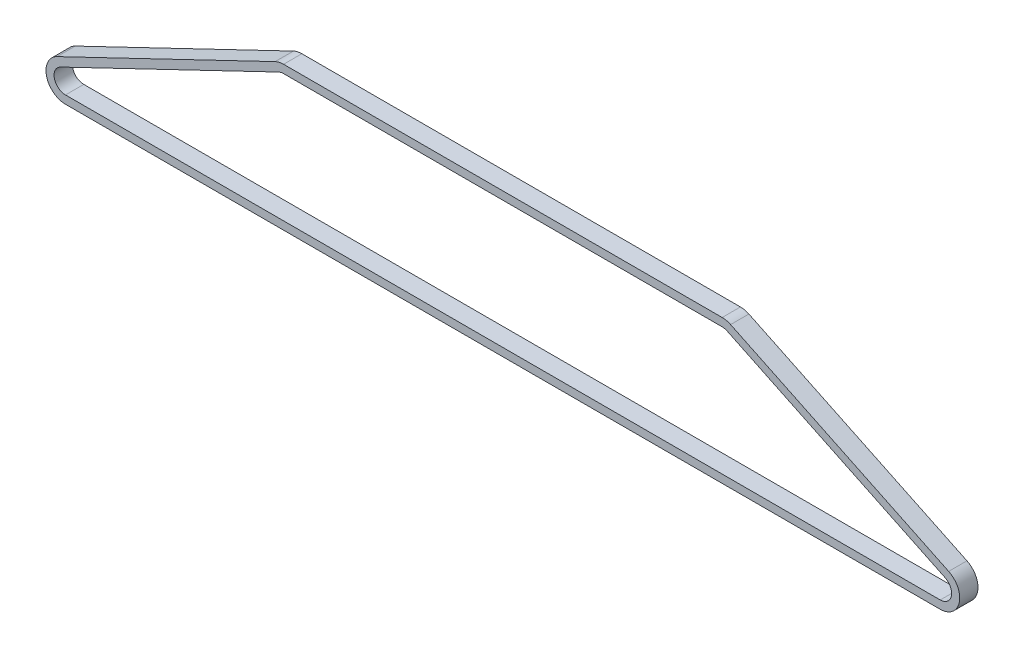
ISO-10303-21;
HEADER;
FILE_DESCRIPTION(('STEP AP214'),'2;1');
FILE_NAME('part.step','',(''),(''),'','','');
FILE_SCHEMA(('AUTOMOTIVE_DESIGN { 1 0 10303 214 1 1 1 1 }'));
ENDSEC;
DATA;
#1=APPLICATION_CONTEXT('core data for automotive mechanical design processes');
#2=APPLICATION_PROTOCOL_DEFINITION('international standard','automotive_design',2000,#1);
#3=PRODUCT_CONTEXT('',#1,'mechanical');
#4=PRODUCT('Part','Part','',(#3));
#5=PRODUCT_RELATED_PRODUCT_CATEGORY('part','',(#4));
#6=PRODUCT_DEFINITION_FORMATION('','',#4);
#7=PRODUCT_DEFINITION_CONTEXT('part definition',#1,'design');
#8=PRODUCT_DEFINITION('design','',#6,#7);
#9=PRODUCT_DEFINITION_SHAPE('','',#8);
#10=(LENGTH_UNIT() NAMED_UNIT(*) SI_UNIT(.MILLI.,.METRE.));
#11=(NAMED_UNIT(*) PLANE_ANGLE_UNIT() SI_UNIT($,.RADIAN.));
#12=(NAMED_UNIT(*) SI_UNIT($,.STERADIAN.) SOLID_ANGLE_UNIT());
#13=UNCERTAINTY_MEASURE_WITH_UNIT(LENGTH_MEASURE(1.E-05),#10,'distance_accuracy_value','');
#14=(GEOMETRIC_REPRESENTATION_CONTEXT(3) GLOBAL_UNCERTAINTY_ASSIGNED_CONTEXT((#13)) GLOBAL_UNIT_ASSIGNED_CONTEXT((#10,
#11,#12)) REPRESENTATION_CONTEXT('',''));
#15=CARTESIAN_POINT('',(0.,0.,0.));
#16=DIRECTION('',(0.,0.,1.));
#17=DIRECTION('',(1.,0.,0.));
#18=AXIS2_PLACEMENT_3D('',#15,#16,#17);
#19=CARTESIAN_POINT('',(0.,-20.3867300504674,3.));
#20=DIRECTION('',(0.,-1.,0.));
#21=DIRECTION('',(1.,0.,0.));
#22=AXIS2_PLACEMENT_3D('',#19,#20,#21);
#23=PLANE('',#22);
#24=DIRECTION('',(-1.,0.,0.));
#25=VECTOR('',#24,1.);
#26=CARTESIAN_POINT('',(0.,-20.3867300504674,0.));
#27=LINE('',#26,#25);
#28=CARTESIAN_POINT('',(35.8,-20.3867300504674,0.));
#29=VERTEX_POINT('',#28);
#30=CARTESIAN_POINT('',(-107.8,-20.3867300504674,0.));
#31=VERTEX_POINT('',#30);
#32=EDGE_CURVE('E213',#29,#31,#27,.T.);
#33=ORIENTED_EDGE('',*,*,#32,.F.);
#34=DIRECTION('',(0.,0.,-1.));
#35=VECTOR('',#34,1.);
#36=CARTESIAN_POINT('',(35.8,-20.3867300504674,3.));
#37=LINE('',#36,#35);
#38=CARTESIAN_POINT('',(35.8,-20.3867300504674,3.));
#39=VERTEX_POINT('',#38);
#40=EDGE_CURVE('E11',#39,#29,#37,.T.);
#41=ORIENTED_EDGE('',*,*,#40,.F.);
#42=DIRECTION('',(-1.,0.,0.));
#43=VECTOR('',#42,1.);
#44=CARTESIAN_POINT('',(0.,-20.3867300504674,3.));
#45=LINE('',#44,#43);
#46=CARTESIAN_POINT('',(-107.8,-20.3867300504674,3.));
#47=VERTEX_POINT('',#46);
#48=EDGE_CURVE('E487',#39,#47,#45,.T.);
#49=ORIENTED_EDGE('',*,*,#48,.T.);
#50=DIRECTION('',(0.,0.,-1.));
#51=VECTOR('',#50,1.);
#52=CARTESIAN_POINT('',(-107.8,-20.3867300504674,3.));
#53=LINE('',#52,#51);
#54=EDGE_CURVE('E118',#47,#31,#53,.T.);
#55=ORIENTED_EDGE('',*,*,#54,.T.);
#56=EDGE_LOOP('',(#33,#41,#49,#55));
#57=FACE_BOUND('',#56,.T.);
#58=ADVANCED_FACE('F41',(#57),#23,.T.);
#59=CARTESIAN_POINT('',(35.8,-17.1867300504674,3.));
#60=DIRECTION('',(0.,0.,-1.));
#61=DIRECTION('',(-1.,0.,0.));
#62=AXIS2_PLACEMENT_3D('',#59,#60,#61);
#63=CYLINDRICAL_SURFACE('',#62,3.19999999999998);
#64=CARTESIAN_POINT('',(35.8,-17.1867300504674,0.));
#65=DIRECTION('',(0.,0.,1.));
#66=DIRECTION('',(1.,0.,0.));
#67=AXIS2_PLACEMENT_3D('',#64,#65,#66);
#68=CIRCLE('',#67,3.19999999999998);
#69=CARTESIAN_POINT('',(37.1849182085513,-14.3019420936805,0.));
#70=VERTEX_POINT('',#69);
#71=EDGE_CURVE('E216',#29,#70,#68,.T.);
#72=ORIENTED_EDGE('',*,*,#71,.T.);
#73=DIRECTION('',(0.,0.,-1.));
#74=VECTOR('',#73,1.);
#75=CARTESIAN_POINT('',(37.1849182085513,-14.3019420936805,3.));
#76=LINE('',#75,#74);
#77=CARTESIAN_POINT('',(37.1849182085513,-14.3019420936805,3.));
#78=VERTEX_POINT('',#77);
#79=EDGE_CURVE('E51',#78,#70,#76,.T.);
#80=ORIENTED_EDGE('',*,*,#79,.F.);
#81=CARTESIAN_POINT('',(35.8,-17.1867300504674,3.));
#82=DIRECTION('',(0.,0.,1.));
#83=DIRECTION('',(1.,0.,0.));
#84=AXIS2_PLACEMENT_3D('',#81,#82,#83);
#85=CIRCLE('',#84,3.19999999999998);
#86=EDGE_CURVE('E485',#39,#78,#85,.T.);
#87=ORIENTED_EDGE('',*,*,#86,.F.);
#88=ORIENTED_EDGE('',*,*,#40,.T.);
#89=EDGE_LOOP('',(#72,#80,#87,#88));
#90=FACE_BOUND('',#89,.T.);
#91=ADVANCED_FACE('F305',(#90),#63,.T.);
#92=CARTESIAN_POINT('',(1.38491820855131,2.88478795678694,3.));
#93=DIRECTION('',(-0.432786940172284,-0.901496236495922,0.));
#94=DIRECTION('',(0.901496236495922,-0.432786940172284,0.));
#95=AXIS2_PLACEMENT_3D('',#92,#93,#94);
#96=PLANE('',#95);
#97=DIRECTION('',(-0.901496236495922,0.432786940172284,0.));
#98=VECTOR('',#97,1.);
#99=CARTESIAN_POINT('',(1.38491820855131,2.88478795678694,0.));
#100=LINE('',#99,#98);
#101=CARTESIAN_POINT('',(1.3849182085513,2.88478795678695,0.));
#102=VERTEX_POINT('',#101);
#103=EDGE_CURVE('E219',#70,#102,#100,.T.);
#104=ORIENTED_EDGE('',*,*,#103,.T.);
#105=DIRECTION('',(0.,0.,-1.));
#106=VECTOR('',#105,1.);
#107=CARTESIAN_POINT('',(1.3849182085513,2.88478795678695,3.));
#108=LINE('',#107,#106);
#109=CARTESIAN_POINT('',(1.3849182085513,2.88478795678695,3.));
#110=VERTEX_POINT('',#109);
#111=EDGE_CURVE('E239',#110,#102,#108,.T.);
#112=ORIENTED_EDGE('',*,*,#111,.F.);
#113=DIRECTION('',(-0.901496236495922,0.432786940172284,0.));
#114=VECTOR('',#113,1.);
#115=CARTESIAN_POINT('',(1.38491820855131,2.88478795678694,3.));
#116=LINE('',#115,#114);
#117=EDGE_CURVE('E481',#78,#110,#116,.T.);
#118=ORIENTED_EDGE('',*,*,#117,.F.);
#119=ORIENTED_EDGE('',*,*,#79,.T.);
#120=EDGE_LOOP('',(#104,#112,#118,#119));
#121=FACE_BOUND('',#120,.T.);
#122=ADVANCED_FACE('F310',(#121),#96,.F.);
#123=CARTESIAN_POINT('',(0.,0.,3.));
#124=DIRECTION('',(0.,0.,-1.));
#125=DIRECTION('',(-1.,0.,0.));
#126=AXIS2_PLACEMENT_3D('',#123,#124,#125);
#127=CYLINDRICAL_SURFACE('',#126,3.2);
#128=CARTESIAN_POINT('',(0.,0.,0.));
#129=DIRECTION('',(0.,0.,1.));
#130=DIRECTION('',(1.,0.,0.));
#131=AXIS2_PLACEMENT_3D('',#128,#129,#130);
#132=CIRCLE('',#131,3.2);
#133=CARTESIAN_POINT('',(0.,3.2,0.));
#134=VERTEX_POINT('',#133);
#135=EDGE_CURVE('E222',#102,#134,#132,.T.);
#136=ORIENTED_EDGE('',*,*,#135,.T.);
#137=DIRECTION('',(0.,0.,-1.));
#138=VECTOR('',#137,1.);
#139=CARTESIAN_POINT('',(0.,3.2,3.));
#140=LINE('',#139,#138);
#141=CARTESIAN_POINT('',(0.,3.2,3.));
#142=VERTEX_POINT('',#141);
#143=EDGE_CURVE('E237',#142,#134,#140,.T.);
#144=ORIENTED_EDGE('',*,*,#143,.F.);
#145=CARTESIAN_POINT('',(0.,0.,3.));
#146=DIRECTION('',(0.,0.,1.));
#147=DIRECTION('',(1.,0.,0.));
#148=AXIS2_PLACEMENT_3D('',#145,#146,#147);
#149=CIRCLE('',#148,3.2);
#150=EDGE_CURVE('E479',#110,#142,#149,.T.);
#151=ORIENTED_EDGE('',*,*,#150,.F.);
#152=ORIENTED_EDGE('',*,*,#111,.T.);
#153=EDGE_LOOP('',(#136,#144,#151,#152));
#154=FACE_BOUND('',#153,.T.);
#155=ADVANCED_FACE('F428',(#154),#127,.T.);
#156=CARTESIAN_POINT('',(0.,3.2,3.));
#157=DIRECTION('',(0.,1.,0.));
#158=DIRECTION('',(0.,0.,1.));
#159=AXIS2_PLACEMENT_3D('',#156,#157,#158);
#160=PLANE('',#159);
#161=DIRECTION('',(1.,0.,0.));
#162=VECTOR('',#161,1.);
#163=CARTESIAN_POINT('',(0.,3.2,0.));
#164=LINE('',#163,#162);
#165=CARTESIAN_POINT('',(-72.,3.2,0.));
#166=VERTEX_POINT('',#165);
#167=EDGE_CURVE('E225',#166,#134,#164,.T.);
#168=ORIENTED_EDGE('',*,*,#167,.F.);
#169=DIRECTION('',(0.,0.,-1.));
#170=VECTOR('',#169,1.);
#171=CARTESIAN_POINT('',(-72.,3.2,3.));
#172=LINE('',#171,#170);
#173=CARTESIAN_POINT('',(-72.,3.2,3.));
#174=VERTEX_POINT('',#173);
#175=EDGE_CURVE('E181',#174,#166,#172,.T.);
#176=ORIENTED_EDGE('',*,*,#175,.F.);
#177=DIRECTION('',(1.,0.,0.));
#178=VECTOR('',#177,1.);
#179=CARTESIAN_POINT('',(0.,3.2,3.));
#180=LINE('',#179,#178);
#181=EDGE_CURVE('E170',#174,#142,#180,.T.);
#182=ORIENTED_EDGE('',*,*,#181,.T.);
#183=ORIENTED_EDGE('',*,*,#143,.T.);
#184=EDGE_LOOP('',(#168,#176,#182,#183));
#185=FACE_BOUND('',#184,.T.);
#186=ADVANCED_FACE('F420',(#185),#160,.T.);
#187=CARTESIAN_POINT('',(-72.,0.,3.));
#188=DIRECTION('',(0.,0.,-1.));
#189=DIRECTION('',(-1.,0.,0.));
#190=AXIS2_PLACEMENT_3D('',#187,#188,#189);
#191=CYLINDRICAL_SURFACE('',#190,3.19999999999999);
#192=CARTESIAN_POINT('',(-72.,0.,0.));
#193=DIRECTION('',(0.,0.,1.));
#194=DIRECTION('',(1.,0.,0.));
#195=AXIS2_PLACEMENT_3D('',#192,#193,#194);
#196=CIRCLE('',#195,3.19999999999999);
#197=CARTESIAN_POINT('',(-73.3849182085513,2.88478795678694,0.));
#198=VERTEX_POINT('',#197);
#199=EDGE_CURVE('E177',#166,#198,#196,.T.);
#200=ORIENTED_EDGE('',*,*,#199,.T.);
#201=DIRECTION('',(0.,0.,-1.));
#202=VECTOR('',#201,1.);
#203=CARTESIAN_POINT('',(-73.3849182085513,2.88478795678694,3.));
#204=LINE('',#203,#202);
#205=CARTESIAN_POINT('',(-73.3849182085513,2.88478795678694,3.));
#206=VERTEX_POINT('',#205);
#207=EDGE_CURVE('E174',#206,#198,#204,.T.);
#208=ORIENTED_EDGE('',*,*,#207,.F.);
#209=CARTESIAN_POINT('',(-72.,0.,3.));
#210=DIRECTION('',(0.,0.,1.));
#211=DIRECTION('',(1.,0.,0.));
#212=AXIS2_PLACEMENT_3D('',#209,#210,#211);
#213=CIRCLE('',#212,3.19999999999999);
#214=EDGE_CURVE('E164',#174,#206,#213,.T.);
#215=ORIENTED_EDGE('',*,*,#214,.F.);
#216=ORIENTED_EDGE('',*,*,#175,.T.);
#217=EDGE_LOOP('',(#200,#208,#215,#216));
#218=FACE_BOUND('',#217,.T.);
#219=ADVANCED_FACE('F175',(#218),#191,.T.);
#220=CARTESIAN_POINT('',(-14.8708447705768,30.9760053962197,3.));
#221=DIRECTION('',(-0.432786940172284,0.901496236495922,0.));
#222=DIRECTION('',(-0.901496236495923,-0.432786940172284,0.));
#223=AXIS2_PLACEMENT_3D('',#220,#221,#222);
#224=PLANE('',#223);
#225=DIRECTION('',(0.901496236495922,0.432786940172284,0.));
#226=VECTOR('',#225,1.);
#227=CARTESIAN_POINT('',(-14.8708447705768,30.9760053962197,0.));
#228=LINE('',#227,#226);
#229=CARTESIAN_POINT('',(-109.184918208551,-14.3019420936805,0.));
#230=VERTEX_POINT('',#229);
#231=EDGE_CURVE('E229',#230,#198,#228,.T.);
#232=ORIENTED_EDGE('',*,*,#231,.F.);
#233=DIRECTION('',(0.,0.,-1.));
#234=VECTOR('',#233,1.);
#235=CARTESIAN_POINT('',(-109.184918208551,-14.3019420936805,3.));
#236=LINE('',#235,#234);
#237=CARTESIAN_POINT('',(-109.184918208551,-14.3019420936805,3.));
#238=VERTEX_POINT('',#237);
#239=EDGE_CURVE('E111',#238,#230,#236,.T.);
#240=ORIENTED_EDGE('',*,*,#239,.F.);
#241=DIRECTION('',(0.901496236495922,0.432786940172284,0.));
#242=VECTOR('',#241,1.);
#243=CARTESIAN_POINT('',(-14.8708447705768,30.9760053962197,3.));
#244=LINE('',#243,#242);
#245=EDGE_CURVE('E168',#238,#206,#244,.T.);
#246=ORIENTED_EDGE('',*,*,#245,.T.);
#247=ORIENTED_EDGE('',*,*,#207,.T.);
#248=EDGE_LOOP('',(#232,#240,#246,#247));
#249=FACE_BOUND('',#248,.T.);
#250=ADVANCED_FACE('F183',(#249),#224,.T.);
#251=CARTESIAN_POINT('',(0.,0.,3.));
#252=DIRECTION('',(0.,0.,-1.));
#253=DIRECTION('',(-1.,0.,0.));
#254=AXIS2_PLACEMENT_3D('',#251,#252,#253);
#255=CYLINDRICAL_SURFACE('',#254,1.87200000000192);
#256=CARTESIAN_POINT('',(0.,0.,0.));
#257=DIRECTION('',(0.,0.,1.));
#258=DIRECTION('',(1.,0.,0.));
#259=AXIS2_PLACEMENT_3D('',#256,#257,#258);
#260=CIRCLE('',#259,1.87200000000192);
#261=CARTESIAN_POINT('',(0.81017715200334,1.6876009547221,0.));
#262=VERTEX_POINT('',#261);
#263=CARTESIAN_POINT('',(0.,1.87200000000192,0.));
#264=VERTEX_POINT('',#263);
#265=EDGE_CURVE('E189',#262,#264,#260,.T.);
#266=ORIENTED_EDGE('',*,*,#265,.F.);
#267=DIRECTION('',(0.,0.,-1.));
#268=VECTOR('',#267,1.);
#269=CARTESIAN_POINT('',(0.81017715200334,1.6876009547221,3.));
#270=LINE('',#269,#268);
#271=CARTESIAN_POINT('',(0.81017715200334,1.6876009547221,3.));
#272=VERTEX_POINT('',#271);
#273=EDGE_CURVE('E45',#272,#262,#270,.T.);
#274=ORIENTED_EDGE('',*,*,#273,.F.);
#275=CARTESIAN_POINT('',(0.,0.,3.));
#276=DIRECTION('',(0.,0.,1.));
#277=DIRECTION('',(1.,0.,0.));
#278=AXIS2_PLACEMENT_3D('',#275,#276,#277);
#279=CIRCLE('',#278,1.87200000000192);
#280=CARTESIAN_POINT('',(0.,1.87200000000192,3.));
#281=VERTEX_POINT('',#280);
#282=EDGE_CURVE('E233',#272,#281,#279,.T.);
#283=ORIENTED_EDGE('',*,*,#282,.T.);
#284=DIRECTION('',(0.,0.,-1.));
#285=VECTOR('',#284,1.);
#286=CARTESIAN_POINT('',(0.,1.87200000000192,3.));
#287=LINE('',#286,#285);
#288=EDGE_CURVE('E185',#281,#264,#287,.T.);
#289=ORIENTED_EDGE('',*,*,#288,.T.);
#290=EDGE_LOOP('',(#266,#274,#283,#289));
#291=FACE_BOUND('',#290,.T.);
#292=ADVANCED_FACE('F43',(#291),#255,.F.);
#293=CARTESIAN_POINT('',(0.810177152003428,1.68760095472206,3.));
#294=DIRECTION('',(0.432786940172327,0.901496236495902,0.));
#295=DIRECTION('',(-0.901496236495902,0.432786940172327,0.));
#296=AXIS2_PLACEMENT_3D('',#293,#294,#295);
#297=PLANE('',#296);
#298=DIRECTION('',(0.901496236495902,-0.432786940172327,0.));
#299=VECTOR('',#298,1.);
#300=CARTESIAN_POINT('',(0.810177152003428,1.68760095472206,0.));
#301=LINE('',#300,#299);
#302=CARTESIAN_POINT('',(36.6101771520025,-15.4991290957471,0.));
#303=VERTEX_POINT('',#302);
#304=EDGE_CURVE('E192',#262,#303,#301,.T.);
#305=ORIENTED_EDGE('',*,*,#304,.T.);
#306=DIRECTION('',(0.,0.,-1.));
#307=VECTOR('',#306,1.);
#308=CARTESIAN_POINT('',(36.6101771520025,-15.4991290957471,3.));
#309=LINE('',#308,#307);
#310=CARTESIAN_POINT('',(36.6101771520025,-15.4991290957471,3.));
#311=VERTEX_POINT('',#310);
#312=EDGE_CURVE('E254',#311,#303,#309,.T.);
#313=ORIENTED_EDGE('',*,*,#312,.F.);
#314=DIRECTION('',(0.901496236495902,-0.432786940172327,0.));
#315=VECTOR('',#314,1.);
#316=CARTESIAN_POINT('',(0.810177152003428,1.68760095472206,3.));
#317=LINE('',#316,#315);
#318=EDGE_CURVE('E262',#272,#311,#317,.T.);
#319=ORIENTED_EDGE('',*,*,#318,.F.);
#320=ORIENTED_EDGE('',*,*,#273,.T.);
#321=EDGE_LOOP('',(#305,#313,#319,#320));
#322=FACE_BOUND('',#321,.T.);
#323=ADVANCED_FACE('F261',(#322),#297,.F.);
#324=CARTESIAN_POINT('',(35.8,-17.1867300504674,3.));
#325=DIRECTION('',(0.,0.,-1.));
#326=DIRECTION('',(-1.,0.,0.));
#327=AXIS2_PLACEMENT_3D('',#324,#325,#326);
#328=CYLINDRICAL_SURFACE('',#327,1.87200000000001);
#329=CARTESIAN_POINT('',(35.8,-17.1867300504674,0.));
#330=DIRECTION('',(0.,0.,1.));
#331=DIRECTION('',(1.,0.,0.));
#332=AXIS2_PLACEMENT_3D('',#329,#330,#331);
#333=CIRCLE('',#332,1.87200000000001);
#334=CARTESIAN_POINT('',(35.8,-19.0587300504674,0.));
#335=VERTEX_POINT('',#334);
#336=EDGE_CURVE('E195',#335,#303,#333,.T.);
#337=ORIENTED_EDGE('',*,*,#336,.F.);
#338=DIRECTION('',(0.,0.,-1.));
#339=VECTOR('',#338,1.);
#340=CARTESIAN_POINT('',(35.8,-19.0587300504674,3.));
#341=LINE('',#340,#339);
#342=CARTESIAN_POINT('',(35.8,-19.0587300504674,3.));
#343=VERTEX_POINT('',#342);
#344=EDGE_CURVE('E253',#343,#335,#341,.T.);
#345=ORIENTED_EDGE('',*,*,#344,.F.);
#346=CARTESIAN_POINT('',(35.8,-17.1867300504674,3.));
#347=DIRECTION('',(0.,0.,1.));
#348=DIRECTION('',(1.,0.,0.));
#349=AXIS2_PLACEMENT_3D('',#346,#347,#348);
#350=CIRCLE('',#349,1.87200000000001);
#351=EDGE_CURVE('E498',#343,#311,#350,.T.);
#352=ORIENTED_EDGE('',*,*,#351,.T.);
#353=ORIENTED_EDGE('',*,*,#312,.T.);
#354=EDGE_LOOP('',(#337,#345,#352,#353));
#355=FACE_BOUND('',#354,.T.);
#356=ADVANCED_FACE('F296',(#355),#328,.F.);
#357=CARTESIAN_POINT('',(0.,-19.0587300504674,3.));
#358=DIRECTION('',(0.,1.,0.));
#359=DIRECTION('',(0.,0.,1.));
#360=AXIS2_PLACEMENT_3D('',#357,#358,#359);
#361=PLANE('',#360);
#362=DIRECTION('',(1.,0.,0.));
#363=VECTOR('',#362,1.);
#364=CARTESIAN_POINT('',(0.,-19.0587300504674,0.));
#365=LINE('',#364,#363);
#366=CARTESIAN_POINT('',(-107.8,-19.0587300504674,0.));
#367=VERTEX_POINT('',#366);
#368=EDGE_CURVE('E198',#367,#335,#365,.T.);
#369=ORIENTED_EDGE('',*,*,#368,.F.);
#370=DIRECTION('',(0.,0.,-1.));
#371=VECTOR('',#370,1.);
#372=CARTESIAN_POINT('',(-107.8,-19.0587300504674,3.));
#373=LINE('',#372,#371);
#374=CARTESIAN_POINT('',(-107.8,-19.0587300504674,3.));
#375=VERTEX_POINT('',#374);
#376=EDGE_CURVE('E251',#375,#367,#373,.T.);
#377=ORIENTED_EDGE('',*,*,#376,.F.);
#378=DIRECTION('',(1.,0.,0.));
#379=VECTOR('',#378,1.);
#380=CARTESIAN_POINT('',(0.,-19.0587300504674,3.));
#381=LINE('',#380,#379);
#382=EDGE_CURVE('E294',#375,#343,#381,.T.);
#383=ORIENTED_EDGE('',*,*,#382,.T.);
#384=ORIENTED_EDGE('',*,*,#344,.T.);
#385=EDGE_LOOP('',(#369,#377,#383,#384));
#386=FACE_BOUND('',#385,.T.);
#387=ADVANCED_FACE('F293',(#386),#361,.T.);
#388=CARTESIAN_POINT('',(-107.8,-17.1867300504674,3.));
#389=DIRECTION('',(0.,0.,-1.));
#390=DIRECTION('',(-1.,0.,0.));
#391=AXIS2_PLACEMENT_3D('',#388,#389,#390);
#392=CYLINDRICAL_SURFACE('',#391,1.87200000000001);
#393=CARTESIAN_POINT('',(-107.8,-17.1867300504674,0.));
#394=DIRECTION('',(0.,0.,1.));
#395=DIRECTION('',(1.,0.,0.));
#396=AXIS2_PLACEMENT_3D('',#393,#394,#395);
#397=CIRCLE('',#396,1.87200000000001);
#398=CARTESIAN_POINT('',(-108.610177152003,-15.4991290957471,0.));
#399=VERTEX_POINT('',#398);
#400=EDGE_CURVE('E201',#399,#367,#397,.T.);
#401=ORIENTED_EDGE('',*,*,#400,.F.);
#402=DIRECTION('',(0.,0.,-1.));
#403=VECTOR('',#402,1.);
#404=CARTESIAN_POINT('',(-108.610177152003,-15.4991290957471,3.));
#405=LINE('',#404,#403);
#406=CARTESIAN_POINT('',(-108.610177152003,-15.4991290957471,3.));
#407=VERTEX_POINT('',#406);
#408=EDGE_CURVE('E249',#407,#399,#405,.T.);
#409=ORIENTED_EDGE('',*,*,#408,.F.);
#410=CARTESIAN_POINT('',(-107.8,-17.1867300504674,3.));
#411=DIRECTION('',(0.,0.,1.));
#412=DIRECTION('',(1.,0.,0.));
#413=AXIS2_PLACEMENT_3D('',#410,#411,#412);
#414=CIRCLE('',#413,1.87200000000001);
#415=EDGE_CURVE('E289',#407,#375,#414,.T.);
#416=ORIENTED_EDGE('',*,*,#415,.T.);
#417=ORIENTED_EDGE('',*,*,#376,.T.);
#418=EDGE_LOOP('',(#401,#409,#416,#417));
#419=FACE_BOUND('',#418,.T.);
#420=ADVANCED_FACE('F285',(#419),#392,.F.);
#421=CARTESIAN_POINT('',(-14.2961037140317,29.778818394157,3.));
#422=DIRECTION('',(-0.432786940172327,0.901496236495901,0.));
#423=DIRECTION('',(-0.901496236495902,-0.432786940172327,0.));
#424=AXIS2_PLACEMENT_3D('',#421,#422,#423);
#425=PLANE('',#424);
#426=DIRECTION('',(0.901496236495902,0.432786940172327,0.));
#427=VECTOR('',#426,1.);
#428=CARTESIAN_POINT('',(-14.2961037140317,29.778818394157,0.));
#429=LINE('',#428,#427);
#430=CARTESIAN_POINT('',(-72.8101771520034,1.68760095472209,0.));
#431=VERTEX_POINT('',#430);
#432=EDGE_CURVE('E204',#399,#431,#429,.T.);
#433=ORIENTED_EDGE('',*,*,#432,.T.);
#434=DIRECTION('',(0.,0.,-1.));
#435=VECTOR('',#434,1.);
#436=CARTESIAN_POINT('',(-72.8101771520034,1.68760095472209,3.));
#437=LINE('',#436,#435);
#438=CARTESIAN_POINT('',(-72.8101771520034,1.68760095472209,3.));
#439=VERTEX_POINT('',#438);
#440=EDGE_CURVE('E247',#439,#431,#437,.T.);
#441=ORIENTED_EDGE('',*,*,#440,.F.);
#442=DIRECTION('',(0.901496236495902,0.432786940172327,0.));
#443=VECTOR('',#442,1.);
#444=CARTESIAN_POINT('',(-14.2961037140317,29.778818394157,3.));
#445=LINE('',#444,#443);
#446=EDGE_CURVE('E494',#407,#439,#445,.T.);
#447=ORIENTED_EDGE('',*,*,#446,.F.);
#448=ORIENTED_EDGE('',*,*,#408,.T.);
#449=EDGE_LOOP('',(#433,#441,#447,#448));
#450=FACE_BOUND('',#449,.T.);
#451=ADVANCED_FACE('F282',(#450),#425,.F.);
#452=CARTESIAN_POINT('',(-72.,0.,3.));
#453=DIRECTION('',(0.,0.,-1.));
#454=DIRECTION('',(-1.,0.,0.));
#455=AXIS2_PLACEMENT_3D('',#452,#453,#454);
#456=CYLINDRICAL_SURFACE('',#455,1.87200000000192);
#457=CARTESIAN_POINT('',(-72.,0.,0.));
#458=DIRECTION('',(0.,0.,1.));
#459=DIRECTION('',(1.,0.,0.));
#460=AXIS2_PLACEMENT_3D('',#457,#458,#459);
#461=CIRCLE('',#460,1.87200000000192);
#462=CARTESIAN_POINT('',(-72.,1.87200000000192,0.));
#463=VERTEX_POINT('',#462);
#464=EDGE_CURVE('E207',#463,#431,#461,.T.);
#465=ORIENTED_EDGE('',*,*,#464,.F.);
#466=DIRECTION('',(0.,0.,-1.));
#467=VECTOR('',#466,1.);
#468=CARTESIAN_POINT('',(-72.,1.87200000000192,3.));
#469=LINE('',#468,#467);
#470=CARTESIAN_POINT('',(-72.,1.87200000000192,3.));
#471=VERTEX_POINT('',#470);
#472=EDGE_CURVE('E245',#471,#463,#469,.T.);
#473=ORIENTED_EDGE('',*,*,#472,.F.);
#474=CARTESIAN_POINT('',(-72.,0.,3.));
#475=DIRECTION('',(0.,0.,1.));
#476=DIRECTION('',(1.,0.,0.));
#477=AXIS2_PLACEMENT_3D('',#474,#475,#476);
#478=CIRCLE('',#477,1.87200000000192);
#479=EDGE_CURVE('E279',#471,#439,#478,.T.);
#480=ORIENTED_EDGE('',*,*,#479,.T.);
#481=ORIENTED_EDGE('',*,*,#440,.T.);
#482=EDGE_LOOP('',(#465,#473,#480,#481));
#483=FACE_BOUND('',#482,.T.);
#484=ADVANCED_FACE('F275',(#483),#456,.F.);
#485=CARTESIAN_POINT('',(0.,1.87200000000192,3.));
#486=DIRECTION('',(0.,1.,0.));
#487=DIRECTION('',(-1.,0.,0.));
#488=AXIS2_PLACEMENT_3D('',#485,#486,#487);
#489=PLANE('',#488);
#490=DIRECTION('',(1.,0.,0.));
#491=VECTOR('',#490,1.);
#492=CARTESIAN_POINT('',(0.,1.87200000000192,0.));
#493=LINE('',#492,#491);
#494=EDGE_CURVE('E210',#463,#264,#493,.T.);
#495=ORIENTED_EDGE('',*,*,#494,.T.);
#496=ORIENTED_EDGE('',*,*,#288,.F.);
#497=DIRECTION('',(1.,0.,0.));
#498=VECTOR('',#497,1.);
#499=CARTESIAN_POINT('',(0.,1.87200000000192,3.));
#500=LINE('',#499,#498);
#501=EDGE_CURVE('E490',#471,#281,#500,.T.);
#502=ORIENTED_EDGE('',*,*,#501,.F.);
#503=ORIENTED_EDGE('',*,*,#472,.T.);
#504=EDGE_LOOP('',(#495,#496,#502,#503));
#505=FACE_BOUND('',#504,.T.);
#506=ADVANCED_FACE('F271',(#505),#489,.F.);
#507=CARTESIAN_POINT('',(-107.8,-17.1867300504674,3.));
#508=DIRECTION('',(0.,0.,-1.));
#509=DIRECTION('',(-1.,0.,0.));
#510=AXIS2_PLACEMENT_3D('',#507,#508,#509);
#511=CYLINDRICAL_SURFACE('',#510,3.19999999999999);
#512=CARTESIAN_POINT('',(-107.8,-17.1867300504674,0.));
#513=DIRECTION('',(0.,0.,1.));
#514=DIRECTION('',(1.,0.,0.));
#515=AXIS2_PLACEMENT_3D('',#512,#513,#514);
#516=CIRCLE('',#515,3.19999999999999);
#517=EDGE_CURVE('E231',#230,#31,#516,.T.);
#518=ORIENTED_EDGE('',*,*,#517,.T.);
#519=ORIENTED_EDGE('',*,*,#54,.F.);
#520=CARTESIAN_POINT('',(-107.8,-17.1867300504674,3.));
#521=DIRECTION('',(0.,0.,1.));
#522=DIRECTION('',(1.,0.,0.));
#523=AXIS2_PLACEMENT_3D('',#520,#521,#522);
#524=CIRCLE('',#523,3.19999999999999);
#525=EDGE_CURVE('E60',#238,#47,#524,.T.);
#526=ORIENTED_EDGE('',*,*,#525,.F.);
#527=ORIENTED_EDGE('',*,*,#239,.T.);
#528=EDGE_LOOP('',(#518,#519,#526,#527));
#529=FACE_BOUND('',#528,.T.);
#530=ADVANCED_FACE('F317',(#529),#511,.T.);
#531=CARTESIAN_POINT('',(0.,0.,3.));
#532=DIRECTION('',(0.,0.,1.));
#533=DIRECTION('',(1.,0.,0.));
#534=AXIS2_PLACEMENT_3D('',#531,#532,#533);
#535=PLANE('',#534);
#536=ORIENTED_EDGE('',*,*,#282,.F.);
#537=ORIENTED_EDGE('',*,*,#318,.T.);
#538=ORIENTED_EDGE('',*,*,#351,.F.);
#539=ORIENTED_EDGE('',*,*,#382,.F.);
#540=ORIENTED_EDGE('',*,*,#415,.F.);
#541=ORIENTED_EDGE('',*,*,#446,.T.);
#542=ORIENTED_EDGE('',*,*,#479,.F.);
#543=ORIENTED_EDGE('',*,*,#501,.T.);
#544=EDGE_LOOP('',(#536,#537,#538,#539,#540,#541,#542,#543));
#545=FACE_BOUND('',#544,.T.);
#546=ORIENTED_EDGE('',*,*,#48,.F.);
#547=ORIENTED_EDGE('',*,*,#86,.T.);
#548=ORIENTED_EDGE('',*,*,#117,.T.);
#549=ORIENTED_EDGE('',*,*,#150,.T.);
#550=ORIENTED_EDGE('',*,*,#181,.F.);
#551=ORIENTED_EDGE('',*,*,#214,.T.);
#552=ORIENTED_EDGE('',*,*,#245,.F.);
#553=ORIENTED_EDGE('',*,*,#525,.T.);
#554=EDGE_LOOP('',(#546,#547,#548,#549,#550,#551,#552,#553));
#555=FACE_BOUND('',#554,.T.);
#556=ADVANCED_FACE('F166',(#545,#555),#535,.T.);
#557=CARTESIAN_POINT('',(0.,0.,0.));
#558=DIRECTION('',(0.,0.,1.));
#559=DIRECTION('',(1.,0.,0.));
#560=AXIS2_PLACEMENT_3D('',#557,#558,#559);
#561=PLANE('',#560);
#562=ORIENTED_EDGE('',*,*,#265,.T.);
#563=ORIENTED_EDGE('',*,*,#494,.F.);
#564=ORIENTED_EDGE('',*,*,#464,.T.);
#565=ORIENTED_EDGE('',*,*,#432,.F.);
#566=ORIENTED_EDGE('',*,*,#400,.T.);
#567=ORIENTED_EDGE('',*,*,#368,.T.);
#568=ORIENTED_EDGE('',*,*,#336,.T.);
#569=ORIENTED_EDGE('',*,*,#304,.F.);
#570=EDGE_LOOP('',(#562,#563,#564,#565,#566,#567,#568,#569));
#571=FACE_BOUND('',#570,.T.);
#572=ORIENTED_EDGE('',*,*,#32,.T.);
#573=ORIENTED_EDGE('',*,*,#517,.F.);
#574=ORIENTED_EDGE('',*,*,#231,.T.);
#575=ORIENTED_EDGE('',*,*,#199,.F.);
#576=ORIENTED_EDGE('',*,*,#167,.T.);
#577=ORIENTED_EDGE('',*,*,#135,.F.);
#578=ORIENTED_EDGE('',*,*,#103,.F.);
#579=ORIENTED_EDGE('',*,*,#71,.F.);
#580=EDGE_LOOP('',(#572,#573,#574,#575,#576,#577,#578,#579));
#581=FACE_BOUND('',#580,.T.);
#582=ADVANCED_FACE('F265',(#571,#581),#561,.F.);
#583=CLOSED_SHELL('',(#58,#91,#122,#155,#186,#219,#250,#292,#323,#356,#387,#420,#451,#484,#506,
#530,#556,#582));
#584=MANIFOLD_SOLID_BREP('B2',#583);
#585=ADVANCED_BREP_SHAPE_REPRESENTATION('',(#18,#584),#14);
#586=SHAPE_DEFINITION_REPRESENTATION(#9,#585);
ENDSEC;
END-ISO-10303-21;
